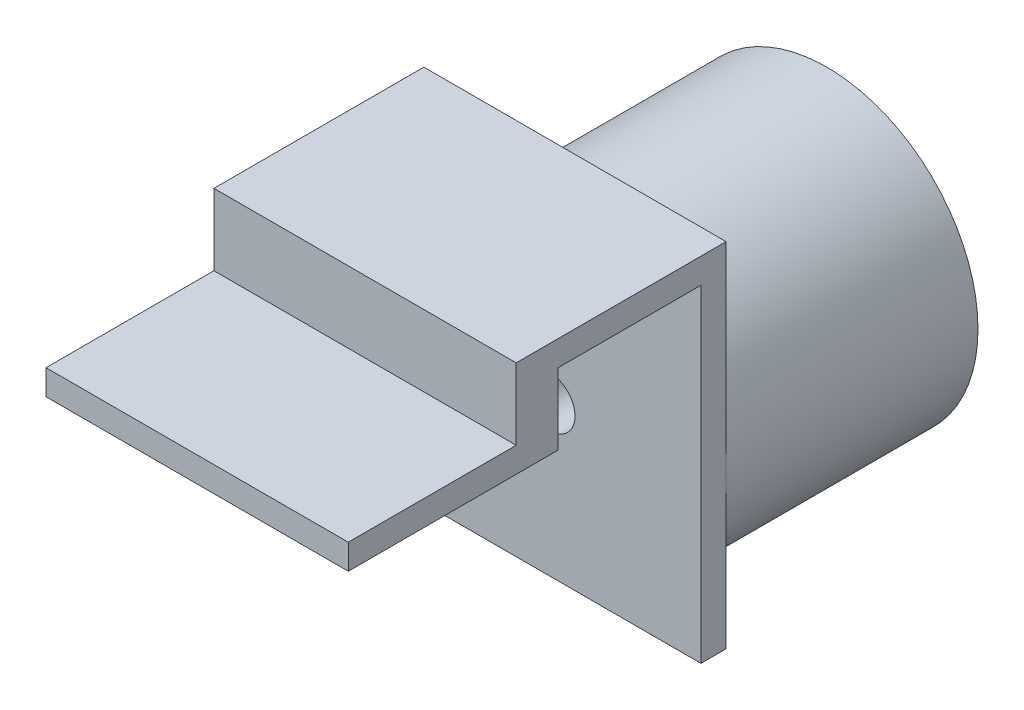
ISO-10303-21;
HEADER;
FILE_DESCRIPTION(('STEP AP214'),'2;1');
FILE_NAME('part.step','',(''),(''),'','','');
FILE_SCHEMA(('AUTOMOTIVE_DESIGN { 1 0 10303 214 1 1 1 1 }'));
ENDSEC;
DATA;
#1=APPLICATION_CONTEXT('core data for automotive mechanical design processes');
#2=APPLICATION_PROTOCOL_DEFINITION('international standard','automotive_design',2000,#1);
#3=PRODUCT_CONTEXT('',#1,'mechanical');
#4=PRODUCT('Part','Part','',(#3));
#5=PRODUCT_RELATED_PRODUCT_CATEGORY('part','',(#4));
#6=PRODUCT_DEFINITION_FORMATION('','',#4);
#7=PRODUCT_DEFINITION_CONTEXT('part definition',#1,'design');
#8=PRODUCT_DEFINITION('design','',#6,#7);
#9=PRODUCT_DEFINITION_SHAPE('','',#8);
#10=(LENGTH_UNIT() NAMED_UNIT(*) SI_UNIT(.MILLI.,.METRE.));
#11=(NAMED_UNIT(*) PLANE_ANGLE_UNIT() SI_UNIT($,.RADIAN.));
#12=(NAMED_UNIT(*) SI_UNIT($,.STERADIAN.) SOLID_ANGLE_UNIT());
#13=UNCERTAINTY_MEASURE_WITH_UNIT(LENGTH_MEASURE(1.E-05),#10,'distance_accuracy_value','');
#14=(GEOMETRIC_REPRESENTATION_CONTEXT(3) GLOBAL_UNCERTAINTY_ASSIGNED_CONTEXT((#13)) GLOBAL_UNIT_ASSIGNED_CONTEXT((#10,
#11,#12)) REPRESENTATION_CONTEXT('',''));
#15=CARTESIAN_POINT('',(0.,0.,0.));
#16=DIRECTION('',(0.,0.,1.));
#17=DIRECTION('',(1.,0.,0.));
#18=AXIS2_PLACEMENT_3D('',#15,#16,#17);
#19=CARTESIAN_POINT('',(0.,0.,55.));
#20=DIRECTION('',(0.,0.,-1.));
#21=DIRECTION('',(-1.,0.,0.));
#22=AXIS2_PLACEMENT_3D('',#19,#20,#21);
#23=PLANE('',#22);
#24=DIRECTION('',(-1.,0.,0.));
#25=VECTOR('',#24,1.);
#26=CARTESIAN_POINT('',(-18.,15.5,55.));
#27=LINE('',#26,#25);
#28=CARTESIAN_POINT('',(18.,15.5,55.));
#29=VERTEX_POINT('',#28);
#30=CARTESIAN_POINT('',(-18.,15.5,55.));
#31=VERTEX_POINT('',#30);
#32=EDGE_CURVE('E50',#29,#31,#27,.T.);
#33=ORIENTED_EDGE('',*,*,#32,.F.);
#34=DIRECTION('',(0.,1.,0.));
#35=VECTOR('',#34,1.);
#36=CARTESIAN_POINT('',(18.,21.,55.));
#37=LINE('',#36,#35);
#38=CARTESIAN_POINT('',(18.,24.,55.));
#39=VERTEX_POINT('',#38);
#40=EDGE_CURVE('E161',#29,#39,#37,.T.);
#41=ORIENTED_EDGE('',*,*,#40,.T.);
#42=DIRECTION('',(-1.,0.,0.));
#43=VECTOR('',#42,1.);
#44=CARTESIAN_POINT('',(-18.,24.,55.));
#45=LINE('',#44,#43);
#46=CARTESIAN_POINT('',(-18.,24.,55.));
#47=VERTEX_POINT('',#46);
#48=EDGE_CURVE('E133',#39,#47,#45,.T.);
#49=ORIENTED_EDGE('',*,*,#48,.T.);
#50=DIRECTION('',(0.,-1.,0.));
#51=VECTOR('',#50,1.);
#52=CARTESIAN_POINT('',(-18.,21.,55.));
#53=LINE('',#52,#51);
#54=EDGE_CURVE('E159',#47,#31,#53,.T.);
#55=ORIENTED_EDGE('',*,*,#54,.T.);
#56=EDGE_LOOP('',(#33,#41,#49,#55));
#57=FACE_BOUND('',#56,.T.);
#58=ADVANCED_FACE('F33',(#57),#23,.F.);
#59=CARTESIAN_POINT('',(0.,0.,33.));
#60=DIRECTION('',(0.,0.,1.));
#61=DIRECTION('',(1.,0.,0.));
#62=AXIS2_PLACEMENT_3D('',#59,#60,#61);
#63=PLANE('',#62);
#64=CARTESIAN_POINT('',(0.,0.,33.));
#65=DIRECTION('',(0.,0.,1.));
#66=DIRECTION('',(1.,0.,0.));
#67=AXIS2_PLACEMENT_3D('',#64,#65,#66);
#68=CIRCLE('',#67,3.);
#69=CARTESIAN_POINT('',(3.,0.,33.));
#70=VERTEX_POINT('',#69);
#71=EDGE_CURVE('E179',#70,#70,#68,.T.);
#72=ORIENTED_EDGE('',*,*,#71,.F.);
#73=EDGE_LOOP('',(#72));
#74=FACE_BOUND('',#73,.T.);
#75=DIRECTION('',(0.,1.,0.));
#76=VECTOR('',#75,1.);
#77=CARTESIAN_POINT('',(18.,24.,33.));
#78=LINE('',#77,#76);
#79=CARTESIAN_POINT('',(18.,-18.,33.));
#80=VERTEX_POINT('',#79);
#81=CARTESIAN_POINT('',(18.,21.,33.));
#82=VERTEX_POINT('',#81);
#83=EDGE_CURVE('E186',#80,#82,#78,.T.);
#84=ORIENTED_EDGE('',*,*,#83,.T.);
#85=DIRECTION('',(-1.,0.,0.));
#86=VECTOR('',#85,1.);
#87=CARTESIAN_POINT('',(18.,21.,33.));
#88=LINE('',#87,#86);
#89=CARTESIAN_POINT('',(-18.,21.,33.));
#90=VERTEX_POINT('',#89);
#91=EDGE_CURVE('E170',#82,#90,#88,.T.);
#92=ORIENTED_EDGE('',*,*,#91,.T.);
#93=DIRECTION('',(0.,-1.,0.));
#94=VECTOR('',#93,1.);
#95=CARTESIAN_POINT('',(-18.,24.,33.));
#96=LINE('',#95,#94);
#97=CARTESIAN_POINT('',(-18.,-18.,33.));
#98=VERTEX_POINT('',#97);
#99=EDGE_CURVE('E189',#90,#98,#96,.T.);
#100=ORIENTED_EDGE('',*,*,#99,.T.);
#101=DIRECTION('',(1.,0.,0.));
#102=VECTOR('',#101,1.);
#103=CARTESIAN_POINT('',(-18.,-18.,33.));
#104=LINE('',#103,#102);
#105=EDGE_CURVE('E192',#98,#80,#104,.T.);
#106=ORIENTED_EDGE('',*,*,#105,.T.);
#107=EDGE_LOOP('',(#84,#92,#100,#106));
#108=FACE_BOUND('',#107,.T.);
#109=ADVANCED_FACE('F249',(#74,#108),#63,.T.);
#110=CARTESIAN_POINT('',(0.,0.,30.));
#111=DIRECTION('',(0.,0.,-1.));
#112=DIRECTION('',(-1.,0.,0.));
#113=AXIS2_PLACEMENT_3D('',#110,#111,#112);
#114=CYLINDRICAL_SURFACE('',#113,18.);
#115=CARTESIAN_POINT('',(0.,0.,30.));
#116=DIRECTION('',(0.,0.,1.));
#117=DIRECTION('',(1.,0.,0.));
#118=AXIS2_PLACEMENT_3D('',#115,#116,#117);
#119=CIRCLE('',#118,18.);
#120=CARTESIAN_POINT('',(18.,0.,30.));
#121=VERTEX_POINT('',#120);
#122=CARTESIAN_POINT('',(-18.,0.,30.));
#123=VERTEX_POINT('',#122);
#124=EDGE_CURVE('E11',#121,#123,#119,.T.);
#125=ORIENTED_EDGE('',*,*,#124,.F.);
#126=CARTESIAN_POINT('',(0.,-18.,30.));
#127=VERTEX_POINT('',#126);
#128=EDGE_CURVE('E43',#127,#121,#119,.T.);
#129=ORIENTED_EDGE('',*,*,#128,.F.);
#130=EDGE_CURVE('E42',#123,#127,#119,.T.);
#131=ORIENTED_EDGE('',*,*,#130,.F.);
#132=EDGE_LOOP('',(#125,#129,#131));
#133=FACE_BOUND('',#132,.T.);
#134=CARTESIAN_POINT('',(0.,0.,0.));
#135=DIRECTION('',(0.,0.,1.));
#136=DIRECTION('',(1.,0.,0.));
#137=AXIS2_PLACEMENT_3D('',#134,#135,#136);
#138=CIRCLE('',#137,18.);
#139=CARTESIAN_POINT('',(18.,0.,0.));
#140=VERTEX_POINT('',#139);
#141=EDGE_CURVE('E37',#140,#140,#138,.T.);
#142=ORIENTED_EDGE('',*,*,#141,.T.);
#143=EDGE_LOOP('',(#142));
#144=FACE_BOUND('',#143,.T.);
#145=ADVANCED_FACE('F35',(#133,#144),#114,.T.);
#146=CARTESIAN_POINT('',(0.,0.,0.));
#147=DIRECTION('',(0.,0.,1.));
#148=DIRECTION('',(1.,0.,0.));
#149=AXIS2_PLACEMENT_3D('',#146,#147,#148);
#150=PLANE('',#149);
#151=CARTESIAN_POINT('',(0.,0.,0.));
#152=DIRECTION('',(0.,0.,1.));
#153=DIRECTION('',(1.,0.,0.));
#154=AXIS2_PLACEMENT_3D('',#151,#152,#153);
#155=CIRCLE('',#154,3.);
#156=CARTESIAN_POINT('',(3.,0.,0.));
#157=VERTEX_POINT('',#156);
#158=EDGE_CURVE('E182',#157,#157,#155,.F.);
#159=ORIENTED_EDGE('',*,*,#158,.F.);
#160=EDGE_LOOP('',(#159));
#161=FACE_BOUND('',#160,.T.);
#162=ORIENTED_EDGE('',*,*,#141,.F.);
#163=EDGE_LOOP('',(#162));
#164=FACE_BOUND('',#163,.T.);
#165=ADVANCED_FACE('F248',(#161,#164),#150,.F.);
#166=CARTESIAN_POINT('',(0.,0.,30.));
#167=DIRECTION('',(0.,0.,1.));
#168=DIRECTION('',(1.,0.,0.));
#169=AXIS2_PLACEMENT_3D('',#166,#167,#168);
#170=PLANE('',#169);
#171=DIRECTION('',(0.,1.,0.));
#172=VECTOR('',#171,1.);
#173=CARTESIAN_POINT('',(18.,24.,30.));
#174=LINE('',#173,#172);
#175=CARTESIAN_POINT('',(18.,24.,30.));
#176=VERTEX_POINT('',#175);
#177=EDGE_CURVE('E185',#121,#176,#174,.T.);
#178=ORIENTED_EDGE('',*,*,#177,.F.);
#179=ORIENTED_EDGE('',*,*,#124,.T.);
#180=DIRECTION('',(0.,-1.,0.));
#181=VECTOR('',#180,1.);
#182=CARTESIAN_POINT('',(-18.,24.,30.));
#183=LINE('',#182,#181);
#184=CARTESIAN_POINT('',(-18.,24.,30.));
#185=VERTEX_POINT('',#184);
#186=EDGE_CURVE('E200',#185,#123,#183,.T.);
#187=ORIENTED_EDGE('',*,*,#186,.F.);
#188=DIRECTION('',(-1.,0.,0.));
#189=VECTOR('',#188,1.);
#190=CARTESIAN_POINT('',(-18.,24.,30.));
#191=LINE('',#190,#189);
#192=EDGE_CURVE('E197',#176,#185,#191,.T.);
#193=ORIENTED_EDGE('',*,*,#192,.F.);
#194=EDGE_LOOP('',(#178,#179,#187,#193));
#195=FACE_BOUND('',#194,.T.);
#196=ADVANCED_FACE('F246',(#195),#170,.F.);
#197=CARTESIAN_POINT('',(-18.,-18.,30.));
#198=VERTEX_POINT('',#197);
#199=EDGE_CURVE('E199',#123,#198,#183,.T.);
#200=ORIENTED_EDGE('',*,*,#199,.F.);
#201=ORIENTED_EDGE('',*,*,#130,.T.);
#202=DIRECTION('',(1.,0.,0.));
#203=VECTOR('',#202,1.);
#204=CARTESIAN_POINT('',(-18.,-18.,30.));
#205=LINE('',#204,#203);
#206=EDGE_CURVE('E190',#198,#127,#205,.T.);
#207=ORIENTED_EDGE('',*,*,#206,.F.);
#208=EDGE_LOOP('',(#200,#201,#207));
#209=FACE_BOUND('',#208,.T.);
#210=ADVANCED_FACE('F231',(#209),#170,.F.);
#211=CARTESIAN_POINT('',(18.,-18.,30.));
#212=VERTEX_POINT('',#211);
#213=EDGE_CURVE('E203',#127,#212,#205,.T.);
#214=ORIENTED_EDGE('',*,*,#213,.F.);
#215=ORIENTED_EDGE('',*,*,#128,.T.);
#216=EDGE_CURVE('E195',#212,#121,#174,.T.);
#217=ORIENTED_EDGE('',*,*,#216,.F.);
#218=EDGE_LOOP('',(#214,#215,#217));
#219=FACE_BOUND('',#218,.T.);
#220=ADVANCED_FACE('F233',(#219),#170,.F.);
#221=CARTESIAN_POINT('',(18.,24.,33.));
#222=DIRECTION('',(-1.,0.,0.));
#223=DIRECTION('',(0.,-1.,0.));
#224=AXIS2_PLACEMENT_3D('',#221,#222,#223);
#225=PLANE('',#224);
#226=ORIENTED_EDGE('',*,*,#216,.T.);
#227=ORIENTED_EDGE('',*,*,#177,.T.);
#228=DIRECTION('',(0.,0.,-1.));
#229=VECTOR('',#228,1.);
#230=CARTESIAN_POINT('',(18.,24.,33.));
#231=LINE('',#230,#229);
#232=EDGE_CURVE('E214',#39,#176,#231,.T.);
#233=ORIENTED_EDGE('',*,*,#232,.F.);
#234=ORIENTED_EDGE('',*,*,#40,.F.);
#235=DIRECTION('',(0.,0.,-1.));
#236=VECTOR('',#235,1.);
#237=CARTESIAN_POINT('',(18.,15.5,75.));
#238=LINE('',#237,#236);
#239=CARTESIAN_POINT('',(18.,15.5,75.));
#240=VERTEX_POINT('',#239);
#241=EDGE_CURVE('E140',#240,#29,#238,.T.);
#242=ORIENTED_EDGE('',*,*,#241,.F.);
#243=DIRECTION('',(0.,1.,0.));
#244=VECTOR('',#243,1.);
#245=CARTESIAN_POINT('',(18.,15.5,75.));
#246=LINE('',#245,#244);
#247=CARTESIAN_POINT('',(18.,12.5,75.));
#248=VERTEX_POINT('',#247);
#249=EDGE_CURVE('E136',#248,#240,#246,.T.);
#250=ORIENTED_EDGE('',*,*,#249,.F.);
#251=DIRECTION('',(0.,0.,-1.));
#252=VECTOR('',#251,1.);
#253=CARTESIAN_POINT('',(18.,12.5,55.));
#254=LINE('',#253,#252);
#255=CARTESIAN_POINT('',(18.,12.5,50.));
#256=VERTEX_POINT('',#255);
#257=EDGE_CURVE('E122',#248,#256,#254,.T.);
#258=ORIENTED_EDGE('',*,*,#257,.T.);
#259=DIRECTION('',(0.,1.,0.));
#260=VECTOR('',#259,1.);
#261=CARTESIAN_POINT('',(18.,24.,50.));
#262=LINE('',#261,#260);
#263=CARTESIAN_POINT('',(18.,21.,50.));
#264=VERTEX_POINT('',#263);
#265=EDGE_CURVE('E162',#256,#264,#262,.T.);
#266=ORIENTED_EDGE('',*,*,#265,.T.);
#267=DIRECTION('',(0.,0.,-1.));
#268=VECTOR('',#267,1.);
#269=CARTESIAN_POINT('',(18.,21.,50.));
#270=LINE('',#269,#268);
#271=EDGE_CURVE('E176',#264,#82,#270,.T.);
#272=ORIENTED_EDGE('',*,*,#271,.T.);
#273=ORIENTED_EDGE('',*,*,#83,.F.);
#274=DIRECTION('',(0.,0.,-1.));
#275=VECTOR('',#274,1.);
#276=CARTESIAN_POINT('',(18.,-18.,33.));
#277=LINE('',#276,#275);
#278=EDGE_CURVE('E194',#80,#212,#277,.T.);
#279=ORIENTED_EDGE('',*,*,#278,.T.);
#280=EDGE_LOOP('',(#226,#227,#233,#234,#242,#250,#258,#266,#272,#273,#279));
#281=FACE_BOUND('',#280,.T.);
#282=ADVANCED_FACE('F138',(#281),#225,.F.);
#283=CARTESIAN_POINT('',(-18.,24.,33.));
#284=DIRECTION('',(0.,-1.,0.));
#285=DIRECTION('',(0.,0.,-1.));
#286=AXIS2_PLACEMENT_3D('',#283,#284,#285);
#287=PLANE('',#286);
#288=ORIENTED_EDGE('',*,*,#192,.T.);
#289=DIRECTION('',(0.,0.,-1.));
#290=VECTOR('',#289,1.);
#291=CARTESIAN_POINT('',(-18.,24.,33.));
#292=LINE('',#291,#290);
#293=EDGE_CURVE('E211',#47,#185,#292,.T.);
#294=ORIENTED_EDGE('',*,*,#293,.F.);
#295=ORIENTED_EDGE('',*,*,#48,.F.);
#296=ORIENTED_EDGE('',*,*,#232,.T.);
#297=EDGE_LOOP('',(#288,#294,#295,#296));
#298=FACE_BOUND('',#297,.T.);
#299=ADVANCED_FACE('F284',(#298),#287,.F.);
#300=CARTESIAN_POINT('',(-18.,24.,33.));
#301=DIRECTION('',(1.,0.,0.));
#302=DIRECTION('',(0.,1.,0.));
#303=AXIS2_PLACEMENT_3D('',#300,#301,#302);
#304=PLANE('',#303);
#305=ORIENTED_EDGE('',*,*,#186,.T.);
#306=ORIENTED_EDGE('',*,*,#199,.T.);
#307=DIRECTION('',(0.,0.,-1.));
#308=VECTOR('',#307,1.);
#309=CARTESIAN_POINT('',(-18.,-18.,33.));
#310=LINE('',#309,#308);
#311=EDGE_CURVE('E208',#98,#198,#310,.T.);
#312=ORIENTED_EDGE('',*,*,#311,.F.);
#313=ORIENTED_EDGE('',*,*,#99,.F.);
#314=DIRECTION('',(0.,0.,1.));
#315=VECTOR('',#314,1.);
#316=CARTESIAN_POINT('',(-18.,21.,33.));
#317=LINE('',#316,#315);
#318=CARTESIAN_POINT('',(-18.,21.,50.));
#319=VERTEX_POINT('',#318);
#320=EDGE_CURVE('E58',#90,#319,#317,.T.);
#321=ORIENTED_EDGE('',*,*,#320,.T.);
#322=DIRECTION('',(0.,-1.,0.));
#323=VECTOR('',#322,1.);
#324=CARTESIAN_POINT('',(-18.,12.5,50.));
#325=LINE('',#324,#323);
#326=CARTESIAN_POINT('',(-18.,12.5,50.));
#327=VERTEX_POINT('',#326);
#328=EDGE_CURVE('E158',#319,#327,#325,.T.);
#329=ORIENTED_EDGE('',*,*,#328,.T.);
#330=DIRECTION('',(0.,0.,-1.));
#331=VECTOR('',#330,1.);
#332=CARTESIAN_POINT('',(-18.,12.5,55.));
#333=LINE('',#332,#331);
#334=CARTESIAN_POINT('',(-18.,12.5,75.));
#335=VERTEX_POINT('',#334);
#336=EDGE_CURVE('E132',#335,#327,#333,.T.);
#337=ORIENTED_EDGE('',*,*,#336,.F.);
#338=DIRECTION('',(0.,-1.,0.));
#339=VECTOR('',#338,1.);
#340=CARTESIAN_POINT('',(-18.,12.5,75.));
#341=LINE('',#340,#339);
#342=CARTESIAN_POINT('',(-18.,15.5,75.));
#343=VERTEX_POINT('',#342);
#344=EDGE_CURVE('E148',#343,#335,#341,.T.);
#345=ORIENTED_EDGE('',*,*,#344,.F.);
#346=DIRECTION('',(0.,0.,-1.));
#347=VECTOR('',#346,1.);
#348=CARTESIAN_POINT('',(-18.,15.5,75.));
#349=LINE('',#348,#347);
#350=EDGE_CURVE('E153',#343,#31,#349,.T.);
#351=ORIENTED_EDGE('',*,*,#350,.T.);
#352=ORIENTED_EDGE('',*,*,#54,.F.);
#353=ORIENTED_EDGE('',*,*,#293,.T.);
#354=EDGE_LOOP('',(#305,#306,#312,#313,#321,#329,#337,#345,#351,#352,#353));
#355=FACE_BOUND('',#354,.T.);
#356=ADVANCED_FACE('F241',(#355),#304,.F.);
#357=CARTESIAN_POINT('',(-18.,-18.,33.));
#358=DIRECTION('',(0.,1.,0.));
#359=DIRECTION('',(0.,0.,1.));
#360=AXIS2_PLACEMENT_3D('',#357,#358,#359);
#361=PLANE('',#360);
#362=ORIENTED_EDGE('',*,*,#206,.T.);
#363=ORIENTED_EDGE('',*,*,#213,.T.);
#364=ORIENTED_EDGE('',*,*,#278,.F.);
#365=ORIENTED_EDGE('',*,*,#105,.F.);
#366=ORIENTED_EDGE('',*,*,#311,.T.);
#367=EDGE_LOOP('',(#362,#363,#364,#365,#366));
#368=FACE_BOUND('',#367,.T.);
#369=ADVANCED_FACE('F236',(#368),#361,.F.);
#370=CARTESIAN_POINT('',(0.,0.,33.));
#371=DIRECTION('',(0.,0.,-1.));
#372=DIRECTION('',(-1.,0.,0.));
#373=AXIS2_PLACEMENT_3D('',#370,#371,#372);
#374=CYLINDRICAL_SURFACE('',#373,3.);
#375=ORIENTED_EDGE('',*,*,#71,.T.);
#376=EDGE_LOOP('',(#375));
#377=FACE_BOUND('',#376,.T.);
#378=ORIENTED_EDGE('',*,*,#158,.T.);
#379=EDGE_LOOP('',(#378));
#380=FACE_BOUND('',#379,.T.);
#381=ADVANCED_FACE('F274',(#377,#380),#374,.F.);
#382=CARTESIAN_POINT('',(0.,21.,0.));
#383=DIRECTION('',(0.,1.,0.));
#384=DIRECTION('',(-1.,0.,0.));
#385=AXIS2_PLACEMENT_3D('',#382,#383,#384);
#386=PLANE('',#385);
#387=ORIENTED_EDGE('',*,*,#91,.F.);
#388=ORIENTED_EDGE('',*,*,#271,.F.);
#389=DIRECTION('',(1.,0.,0.));
#390=VECTOR('',#389,1.);
#391=CARTESIAN_POINT('',(-18.,21.,50.));
#392=LINE('',#391,#390);
#393=EDGE_CURVE('E173',#319,#264,#392,.T.);
#394=ORIENTED_EDGE('',*,*,#393,.F.);
#395=ORIENTED_EDGE('',*,*,#320,.F.);
#396=EDGE_LOOP('',(#387,#388,#394,#395));
#397=FACE_BOUND('',#396,.T.);
#398=ADVANCED_FACE('F271',(#397),#386,.F.);
#399=CARTESIAN_POINT('',(18.,12.5,55.));
#400=DIRECTION('',(0.,1.,0.));
#401=DIRECTION('',(-1.,0.,0.));
#402=AXIS2_PLACEMENT_3D('',#399,#400,#401);
#403=PLANE('',#402);
#404=DIRECTION('',(1.,0.,0.));
#405=VECTOR('',#404,1.);
#406=CARTESIAN_POINT('',(18.,12.5,50.));
#407=LINE('',#406,#405);
#408=EDGE_CURVE('E129',#327,#256,#407,.T.);
#409=ORIENTED_EDGE('',*,*,#408,.T.);
#410=ORIENTED_EDGE('',*,*,#257,.F.);
#411=DIRECTION('',(1.,0.,0.));
#412=VECTOR('',#411,1.);
#413=CARTESIAN_POINT('',(18.,12.5,75.));
#414=LINE('',#413,#412);
#415=EDGE_CURVE('E127',#335,#248,#414,.T.);
#416=ORIENTED_EDGE('',*,*,#415,.F.);
#417=ORIENTED_EDGE('',*,*,#336,.T.);
#418=EDGE_LOOP('',(#409,#410,#416,#417));
#419=FACE_BOUND('',#418,.T.);
#420=ADVANCED_FACE('F124',(#419),#403,.F.);
#421=CARTESIAN_POINT('',(0.,0.,50.));
#422=DIRECTION('',(0.,0.,-1.));
#423=DIRECTION('',(-1.,0.,0.));
#424=AXIS2_PLACEMENT_3D('',#421,#422,#423);
#425=PLANE('',#424);
#426=ORIENTED_EDGE('',*,*,#328,.F.);
#427=ORIENTED_EDGE('',*,*,#393,.T.);
#428=ORIENTED_EDGE('',*,*,#265,.F.);
#429=ORIENTED_EDGE('',*,*,#408,.F.);
#430=EDGE_LOOP('',(#426,#427,#428,#429));
#431=FACE_BOUND('',#430,.T.);
#432=ADVANCED_FACE('F265',(#431),#425,.T.);
#433=CARTESIAN_POINT('',(-18.,15.5,75.));
#434=DIRECTION('',(0.,-1.,0.));
#435=DIRECTION('',(0.,0.,-1.));
#436=AXIS2_PLACEMENT_3D('',#433,#434,#435);
#437=PLANE('',#436);
#438=ORIENTED_EDGE('',*,*,#32,.T.);
#439=ORIENTED_EDGE('',*,*,#350,.F.);
#440=DIRECTION('',(-1.,0.,0.));
#441=VECTOR('',#440,1.);
#442=CARTESIAN_POINT('',(-18.,15.5,75.));
#443=LINE('',#442,#441);
#444=EDGE_CURVE('E143',#240,#343,#443,.T.);
#445=ORIENTED_EDGE('',*,*,#444,.F.);
#446=ORIENTED_EDGE('',*,*,#241,.T.);
#447=EDGE_LOOP('',(#438,#439,#445,#446));
#448=FACE_BOUND('',#447,.T.);
#449=ADVANCED_FACE('F263',(#448),#437,.F.);
#450=CARTESIAN_POINT('',(0.,0.,75.));
#451=DIRECTION('',(0.,0.,-1.));
#452=DIRECTION('',(-1.,0.,0.));
#453=AXIS2_PLACEMENT_3D('',#450,#451,#452);
#454=PLANE('',#453);
#455=ORIENTED_EDGE('',*,*,#415,.T.);
#456=ORIENTED_EDGE('',*,*,#249,.T.);
#457=ORIENTED_EDGE('',*,*,#444,.T.);
#458=ORIENTED_EDGE('',*,*,#344,.T.);
#459=EDGE_LOOP('',(#455,#456,#457,#458));
#460=FACE_BOUND('',#459,.T.);
#461=ADVANCED_FACE('F146',(#460),#454,.F.);
#462=CLOSED_SHELL('',(#58,#109,#145,#165,#196,#210,#220,#282,#299,#356,#369,#381,#398,#420,#432,
#449,#461));
#463=MANIFOLD_SOLID_BREP('B2',#462);
#464=ADVANCED_BREP_SHAPE_REPRESENTATION('',(#18,#463),#14);
#465=SHAPE_DEFINITION_REPRESENTATION(#9,#464);
ENDSEC;
END-ISO-10303-21;
